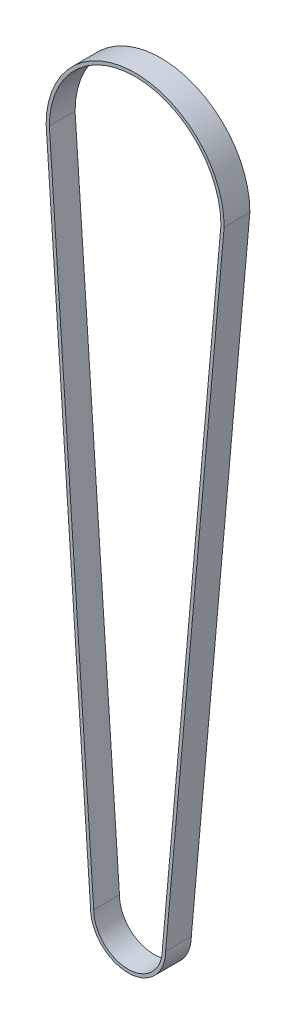
ISO-10303-21;
HEADER;
FILE_DESCRIPTION(('STEP AP214'),'2;1');
FILE_NAME('part.step','',(''),(''),'','','');
FILE_SCHEMA(('AUTOMOTIVE_DESIGN { 1 0 10303 214 1 1 1 1 }'));
ENDSEC;
DATA;
#1=APPLICATION_CONTEXT('core data for automotive mechanical design processes');
#2=APPLICATION_PROTOCOL_DEFINITION('international standard','automotive_design',2000,#1);
#3=PRODUCT_CONTEXT('',#1,'mechanical');
#4=PRODUCT('Part','Part','',(#3));
#5=PRODUCT_RELATED_PRODUCT_CATEGORY('part','',(#4));
#6=PRODUCT_DEFINITION_FORMATION('','',#4);
#7=PRODUCT_DEFINITION_CONTEXT('part definition',#1,'design');
#8=PRODUCT_DEFINITION('design','',#6,#7);
#9=PRODUCT_DEFINITION_SHAPE('','',#8);
#10=(LENGTH_UNIT() NAMED_UNIT(*) SI_UNIT(.MILLI.,.METRE.));
#11=(NAMED_UNIT(*) PLANE_ANGLE_UNIT() SI_UNIT($,.RADIAN.));
#12=(NAMED_UNIT(*) SI_UNIT($,.STERADIAN.) SOLID_ANGLE_UNIT());
#13=UNCERTAINTY_MEASURE_WITH_UNIT(LENGTH_MEASURE(1.E-05),#10,'distance_accuracy_value','');
#14=(GEOMETRIC_REPRESENTATION_CONTEXT(3) GLOBAL_UNCERTAINTY_ASSIGNED_CONTEXT((#13)) GLOBAL_UNIT_ASSIGNED_CONTEXT((#10,
#11,#12)) REPRESENTATION_CONTEXT('',''));
#15=CARTESIAN_POINT('',(0.,0.,0.));
#16=DIRECTION('',(0.,0.,1.));
#17=DIRECTION('',(1.,0.,0.));
#18=AXIS2_PLACEMENT_3D('',#15,#16,#17);
#19=CARTESIAN_POINT('',(0.50953135963383,69.9016651162907,6.));
#20=DIRECTION('',(0.,0.,-1.));
#21=DIRECTION('',(-1.,0.,0.));
#22=AXIS2_PLACEMENT_3D('',#19,#20,#21);
#23=PLANE('',#22);
#24=CARTESIAN_POINT('',(0.50953135963383,69.9016651162907,6.));
#25=DIRECTION('',(0.,0.,1.));
#26=DIRECTION('',(-1.,0.,0.));
#27=AXIS2_PLACEMENT_3D('',#24,#25,#26);
#28=CIRCLE('',#27,20.7499999999999);
#29=CARTESIAN_POINT('',(21.2595040105868,69.8679755823004,6.));
#30=VERTEX_POINT('',#29);
#31=CARTESIAN_POINT('',(-20.2404528948357,69.8761026582027,6.));
#32=VERTEX_POINT('',#31);
#33=EDGE_CURVE('E140',#30,#32,#28,.T.);
#34=ORIENTED_EDGE('',*,*,#33,.T.);
#35=DIRECTION('',(0.067468683577053,-0.997721392341759,0.));
#36=VECTOR('',#35,1.);
#37=CARTESIAN_POINT('',(-20.2404528948357,69.8761026582027,6.));
#38=LINE('',#37,#36);
#39=CARTESIAN_POINT('',(-9.89136706766706,-83.165334843016,6.));
#40=VERTEX_POINT('',#39);
#41=EDGE_CURVE('E143',#32,#40,#38,.T.);
#42=ORIENTED_EDGE('',*,*,#41,.T.);
#43=CARTESIAN_POINT('',(-1.14140538881291,-83.1394385385686,6.));
#44=DIRECTION('',(0.,0.,1.));
#45=DIRECTION('',(1.,0.,0.));
#46=AXIS2_PLACEMENT_3D('',#43,#44,#45);
#47=CIRCLE('',#46,8.75000000000001);
#48=CARTESIAN_POINT('',(7.6085280510738,-83.1735676691225,6.));
#49=VERTEX_POINT('',#48);
#50=EDGE_CURVE('E146',#40,#49,#47,.T.);
#51=ORIENTED_EDGE('',*,*,#50,.T.);
#52=DIRECTION('',(0.0888451087187774,0.996045454111783,0.));
#53=VECTOR('',#52,1.);
#54=CARTESIAN_POINT('',(21.2595040105868,69.8679755823004,6.));
#55=LINE('',#54,#53);
#56=EDGE_CURVE('E148',#49,#30,#55,.T.);
#57=ORIENTED_EDGE('',*,*,#56,.T.);
#58=EDGE_LOOP('',(#34,#42,#51,#57));
#59=FACE_BOUND('',#58,.T.);
#60=CARTESIAN_POINT('',(0.50953135963383,69.9016651162907,6.));
#61=DIRECTION('',(0.,0.,1.));
#62=DIRECTION('',(-1.,0.,0.));
#63=AXIS2_PLACEMENT_3D('',#60,#61,#62);
#64=CIRCLE('',#63,19.9999999999999);
#65=CARTESIAN_POINT('',(20.5095313596337,69.9016651162907,6.));
#66=VERTEX_POINT('',#65);
#67=CARTESIAN_POINT('',(-19.4904686403661,69.9016651162907,6.));
#68=VERTEX_POINT('',#67);
#69=EDGE_CURVE('E104',#66,#68,#64,.T.);
#70=ORIENTED_EDGE('',*,*,#69,.F.);
#71=DIRECTION('',(0.0888451087187774,0.996045454111783,0.));
#72=VECTOR('',#71,1.);
#73=CARTESIAN_POINT('',(20.5095313596337,69.9016651162907,6.));
#74=LINE('',#73,#72);
#75=CARTESIAN_POINT('',(6.8585946111872,-83.1394385385687,6.));
#76=VERTEX_POINT('',#75);
#77=EDGE_CURVE('E126',#76,#66,#74,.T.);
#78=ORIENTED_EDGE('',*,*,#77,.F.);
#79=CARTESIAN_POINT('',(-1.14140538881291,-83.1394385385686,6.));
#80=DIRECTION('',(0.,0.,1.));
#81=DIRECTION('',(1.,0.,0.));
#82=AXIS2_PLACEMENT_3D('',#79,#80,#81);
#83=CIRCLE('',#82,7.9999999999999);
#84=CARTESIAN_POINT('',(-9.14140538881281,-83.1394385385686,6.));
#85=VERTEX_POINT('',#84);
#86=EDGE_CURVE('E124',#85,#76,#83,.T.);
#87=ORIENTED_EDGE('',*,*,#86,.F.);
#88=DIRECTION('',(0.0674686835770529,-0.99772139234176,0.));
#89=VECTOR('',#88,1.);
#90=CARTESIAN_POINT('',(-19.4904686403661,69.9016651162907,6.));
#91=LINE('',#90,#89);
#92=EDGE_CURVE('E112',#68,#85,#91,.T.);
#93=ORIENTED_EDGE('',*,*,#92,.F.);
#94=EDGE_LOOP('',(#70,#78,#87,#93));
#95=FACE_BOUND('',#94,.T.);
#96=ADVANCED_FACE('F39',(#59,#95),#23,.F.);
#97=CARTESIAN_POINT('',(0.50953135963383,69.9016651162907,0.));
#98=DIRECTION('',(0.,0.,-1.));
#99=DIRECTION('',(-1.,0.,0.));
#100=AXIS2_PLACEMENT_3D('',#97,#98,#99);
#101=PLANE('',#100);
#102=CARTESIAN_POINT('',(0.50953135963383,69.9016651162907,0.));
#103=DIRECTION('',(0.,0.,1.));
#104=DIRECTION('',(-1.,0.,0.));
#105=AXIS2_PLACEMENT_3D('',#102,#103,#104);
#106=CIRCLE('',#105,20.7499999999999);
#107=CARTESIAN_POINT('',(21.2595040105868,69.8679755823004,0.));
#108=VERTEX_POINT('',#107);
#109=CARTESIAN_POINT('',(-20.2404528948357,69.8761026582027,0.));
#110=VERTEX_POINT('',#109);
#111=EDGE_CURVE('E120',#108,#110,#106,.T.);
#112=ORIENTED_EDGE('',*,*,#111,.F.);
#113=DIRECTION('',(0.0888451087187774,0.996045454111783,0.));
#114=VECTOR('',#113,1.);
#115=CARTESIAN_POINT('',(21.2595040105868,69.8679755823004,0.));
#116=LINE('',#115,#114);
#117=CARTESIAN_POINT('',(7.6085280510738,-83.1735676691225,0.));
#118=VERTEX_POINT('',#117);
#119=EDGE_CURVE('E144',#118,#108,#116,.T.);
#120=ORIENTED_EDGE('',*,*,#119,.F.);
#121=CARTESIAN_POINT('',(-1.14140538881291,-83.1394385385686,0.));
#122=DIRECTION('',(0.,0.,1.));
#123=DIRECTION('',(1.,0.,0.));
#124=AXIS2_PLACEMENT_3D('',#121,#122,#123);
#125=CIRCLE('',#124,8.75000000000001);
#126=CARTESIAN_POINT('',(-9.89136706766706,-83.165334843016,0.));
#127=VERTEX_POINT('',#126);
#128=EDGE_CURVE('E155',#127,#118,#125,.T.);
#129=ORIENTED_EDGE('',*,*,#128,.F.);
#130=DIRECTION('',(0.067468683577053,-0.997721392341759,0.));
#131=VECTOR('',#130,1.);
#132=CARTESIAN_POINT('',(-20.2404528948357,69.8761026582027,0.));
#133=LINE('',#132,#131);
#134=EDGE_CURVE('E153',#110,#127,#133,.T.);
#135=ORIENTED_EDGE('',*,*,#134,.F.);
#136=EDGE_LOOP('',(#112,#120,#129,#135));
#137=FACE_BOUND('',#136,.T.);
#138=DIRECTION('',(0.0888451087187774,0.996045454111783,0.));
#139=VECTOR('',#138,1.);
#140=CARTESIAN_POINT('',(20.5095313596337,69.9016651162907,0.));
#141=LINE('',#140,#139);
#142=CARTESIAN_POINT('',(6.85859461118699,-83.1394385385686,0.));
#143=VERTEX_POINT('',#142);
#144=CARTESIAN_POINT('',(20.5095313596337,69.9016651162907,0.));
#145=VERTEX_POINT('',#144);
#146=EDGE_CURVE('E113',#143,#145,#141,.T.);
#147=ORIENTED_EDGE('',*,*,#146,.T.);
#148=CARTESIAN_POINT('',(0.50953135963383,69.9016651162907,0.));
#149=DIRECTION('',(0.,0.,1.));
#150=DIRECTION('',(-1.,0.,0.));
#151=AXIS2_PLACEMENT_3D('',#148,#149,#150);
#152=CIRCLE('',#151,19.9999999999999);
#153=CARTESIAN_POINT('',(-19.4904686403661,69.9016651162907,0.));
#154=VERTEX_POINT('',#153);
#155=EDGE_CURVE('E62',#145,#154,#152,.T.);
#156=ORIENTED_EDGE('',*,*,#155,.T.);
#157=DIRECTION('',(0.0674686835770529,-0.99772139234176,0.));
#158=VECTOR('',#157,1.);
#159=CARTESIAN_POINT('',(-19.4904686403661,69.9016651162907,0.));
#160=LINE('',#159,#158);
#161=CARTESIAN_POINT('',(-9.14140538881281,-83.1394385385686,0.));
#162=VERTEX_POINT('',#161);
#163=EDGE_CURVE('E119',#154,#162,#160,.T.);
#164=ORIENTED_EDGE('',*,*,#163,.T.);
#165=CARTESIAN_POINT('',(-1.14140538881291,-83.1394385385686,0.));
#166=DIRECTION('',(0.,0.,1.));
#167=DIRECTION('',(1.,0.,0.));
#168=AXIS2_PLACEMENT_3D('',#165,#166,#167);
#169=CIRCLE('',#168,7.9999999999999);
#170=EDGE_CURVE('E132',#162,#143,#169,.T.);
#171=ORIENTED_EDGE('',*,*,#170,.T.);
#172=EDGE_LOOP('',(#147,#156,#164,#171));
#173=FACE_BOUND('',#172,.T.);
#174=ADVANCED_FACE('F173',(#137,#173),#101,.T.);
#175=CARTESIAN_POINT('',(0.50953135963383,69.9016651162907,6.));
#176=DIRECTION('',(0.,0.,-1.));
#177=DIRECTION('',(-1.,0.,0.));
#178=AXIS2_PLACEMENT_3D('',#175,#176,#177);
#179=CYLINDRICAL_SURFACE('',#178,20.7499999999999);
#180=ORIENTED_EDGE('',*,*,#111,.T.);
#181=DIRECTION('',(0.,0.,-1.));
#182=VECTOR('',#181,1.);
#183=CARTESIAN_POINT('',(-20.2404528948357,69.8761026582027,6.));
#184=LINE('',#183,#182);
#185=EDGE_CURVE('E11',#32,#110,#184,.T.);
#186=ORIENTED_EDGE('',*,*,#185,.F.);
#187=ORIENTED_EDGE('',*,*,#33,.F.);
#188=DIRECTION('',(0.,0.,-1.));
#189=VECTOR('',#188,1.);
#190=CARTESIAN_POINT('',(21.2595040105868,69.8679755823004,6.));
#191=LINE('',#190,#189);
#192=EDGE_CURVE('E150',#30,#108,#191,.T.);
#193=ORIENTED_EDGE('',*,*,#192,.T.);
#194=EDGE_LOOP('',(#180,#186,#187,#193));
#195=FACE_BOUND('',#194,.T.);
#196=ADVANCED_FACE('F41',(#195),#179,.T.);
#197=CARTESIAN_POINT('',(-20.2404528948357,69.8761026582027,6.));
#198=DIRECTION('',(0.99772139234176,0.067468683577053,0.));
#199=DIRECTION('',(-0.067468683577053,0.99772139234176,0.));
#200=AXIS2_PLACEMENT_3D('',#197,#198,#199);
#201=PLANE('',#200);
#202=ORIENTED_EDGE('',*,*,#134,.T.);
#203=DIRECTION('',(0.,0.,-1.));
#204=VECTOR('',#203,1.);
#205=CARTESIAN_POINT('',(-9.89136706766706,-83.165334843016,6.));
#206=LINE('',#205,#204);
#207=EDGE_CURVE('E47',#40,#127,#206,.T.);
#208=ORIENTED_EDGE('',*,*,#207,.F.);
#209=ORIENTED_EDGE('',*,*,#41,.F.);
#210=ORIENTED_EDGE('',*,*,#185,.T.);
#211=EDGE_LOOP('',(#202,#208,#209,#210));
#212=FACE_BOUND('',#211,.T.);
#213=ADVANCED_FACE('F183',(#212),#201,.F.);
#214=CARTESIAN_POINT('',(-1.14140538881291,-83.1394385385686,6.));
#215=DIRECTION('',(0.,0.,-1.));
#216=DIRECTION('',(-1.,0.,0.));
#217=AXIS2_PLACEMENT_3D('',#214,#215,#216);
#218=CYLINDRICAL_SURFACE('',#217,8.75000000000001);
#219=ORIENTED_EDGE('',*,*,#128,.T.);
#220=DIRECTION('',(0.,0.,-1.));
#221=VECTOR('',#220,1.);
#222=CARTESIAN_POINT('',(7.6085280510738,-83.1735676691225,6.));
#223=LINE('',#222,#221);
#224=EDGE_CURVE('E160',#49,#118,#223,.T.);
#225=ORIENTED_EDGE('',*,*,#224,.F.);
#226=ORIENTED_EDGE('',*,*,#50,.F.);
#227=ORIENTED_EDGE('',*,*,#207,.T.);
#228=EDGE_LOOP('',(#219,#225,#226,#227));
#229=FACE_BOUND('',#228,.T.);
#230=ADVANCED_FACE('F167',(#229),#218,.T.);
#231=CARTESIAN_POINT('',(21.2595040105868,69.8679755823004,6.));
#232=DIRECTION('',(-0.996045454111783,0.0888451087187774,0.));
#233=DIRECTION('',(-0.0888451087187774,-0.996045454111783,0.));
#234=AXIS2_PLACEMENT_3D('',#231,#232,#233);
#235=PLANE('',#234);
#236=ORIENTED_EDGE('',*,*,#119,.T.);
#237=ORIENTED_EDGE('',*,*,#192,.F.);
#238=ORIENTED_EDGE('',*,*,#56,.F.);
#239=ORIENTED_EDGE('',*,*,#224,.T.);
#240=EDGE_LOOP('',(#236,#237,#238,#239));
#241=FACE_BOUND('',#240,.T.);
#242=ADVANCED_FACE('F177',(#241),#235,.F.);
#243=CARTESIAN_POINT('',(0.50953135963383,69.9016651162907,6.));
#244=DIRECTION('',(0.,0.,-1.));
#245=DIRECTION('',(-1.,0.,0.));
#246=AXIS2_PLACEMENT_3D('',#243,#244,#245);
#247=CYLINDRICAL_SURFACE('',#246,19.9999999999999);
#248=ORIENTED_EDGE('',*,*,#155,.F.);
#249=DIRECTION('',(0.,0.,-1.));
#250=VECTOR('',#249,1.);
#251=CARTESIAN_POINT('',(20.5095313596337,69.9016651162907,6.));
#252=LINE('',#251,#250);
#253=EDGE_CURVE('E108',#66,#145,#252,.T.);
#254=ORIENTED_EDGE('',*,*,#253,.F.);
#255=ORIENTED_EDGE('',*,*,#69,.T.);
#256=DIRECTION('',(0.,0.,-1.));
#257=VECTOR('',#256,1.);
#258=CARTESIAN_POINT('',(-19.4904686403661,69.9016651162907,6.));
#259=LINE('',#258,#257);
#260=EDGE_CURVE('E107',#68,#154,#259,.T.);
#261=ORIENTED_EDGE('',*,*,#260,.T.);
#262=EDGE_LOOP('',(#248,#254,#255,#261));
#263=FACE_BOUND('',#262,.T.);
#264=ADVANCED_FACE('F106',(#263),#247,.F.);
#265=CARTESIAN_POINT('',(-19.4904686403661,69.9016651162907,6.));
#266=DIRECTION('',(0.99772139234176,0.0674686835770529,0.));
#267=DIRECTION('',(-0.0674686835770529,0.99772139234176,0.));
#268=AXIS2_PLACEMENT_3D('',#265,#266,#267);
#269=PLANE('',#268);
#270=ORIENTED_EDGE('',*,*,#163,.F.);
#271=ORIENTED_EDGE('',*,*,#260,.F.);
#272=ORIENTED_EDGE('',*,*,#92,.T.);
#273=DIRECTION('',(0.,0.,-1.));
#274=VECTOR('',#273,1.);
#275=CARTESIAN_POINT('',(-9.14140538881281,-83.1394385385686,6.));
#276=LINE('',#275,#274);
#277=EDGE_CURVE('E121',#85,#162,#276,.T.);
#278=ORIENTED_EDGE('',*,*,#277,.T.);
#279=EDGE_LOOP('',(#270,#271,#272,#278));
#280=FACE_BOUND('',#279,.T.);
#281=ADVANCED_FACE('F116',(#280),#269,.T.);
#282=CARTESIAN_POINT('',(-1.14140538881291,-83.1394385385686,6.));
#283=DIRECTION('',(0.,0.,-1.));
#284=DIRECTION('',(-1.,0.,0.));
#285=AXIS2_PLACEMENT_3D('',#282,#283,#284);
#286=CYLINDRICAL_SURFACE('',#285,7.9999999999999);
#287=ORIENTED_EDGE('',*,*,#170,.F.);
#288=ORIENTED_EDGE('',*,*,#277,.F.);
#289=ORIENTED_EDGE('',*,*,#86,.T.);
#290=DIRECTION('',(0.,0.,-1.));
#291=VECTOR('',#290,1.);
#292=CARTESIAN_POINT('',(6.85859461118699,-83.1394385385686,6.));
#293=LINE('',#292,#291);
#294=EDGE_CURVE('E54',#76,#143,#293,.T.);
#295=ORIENTED_EDGE('',*,*,#294,.T.);
#296=EDGE_LOOP('',(#287,#288,#289,#295));
#297=FACE_BOUND('',#296,.T.);
#298=ADVANCED_FACE('F206',(#297),#286,.F.);
#299=CARTESIAN_POINT('',(20.5095313596337,69.9016651162907,6.));
#300=DIRECTION('',(-0.996045454111783,0.0888451087187774,0.));
#301=DIRECTION('',(-0.0888451087187774,-0.996045454111783,0.));
#302=AXIS2_PLACEMENT_3D('',#299,#300,#301);
#303=PLANE('',#302);
#304=ORIENTED_EDGE('',*,*,#146,.F.);
#305=ORIENTED_EDGE('',*,*,#294,.F.);
#306=ORIENTED_EDGE('',*,*,#77,.T.);
#307=ORIENTED_EDGE('',*,*,#253,.T.);
#308=EDGE_LOOP('',(#304,#305,#306,#307));
#309=FACE_BOUND('',#308,.T.);
#310=ADVANCED_FACE('F210',(#309),#303,.T.);
#311=CLOSED_SHELL('',(#96,#174,#196,#213,#230,#242,#264,#281,#298,#310));
#312=MANIFOLD_SOLID_BREP('B2',#311);
#313=ADVANCED_BREP_SHAPE_REPRESENTATION('',(#18,#312),#14);
#314=SHAPE_DEFINITION_REPRESENTATION(#9,#313);
ENDSEC;
END-ISO-10303-21;
